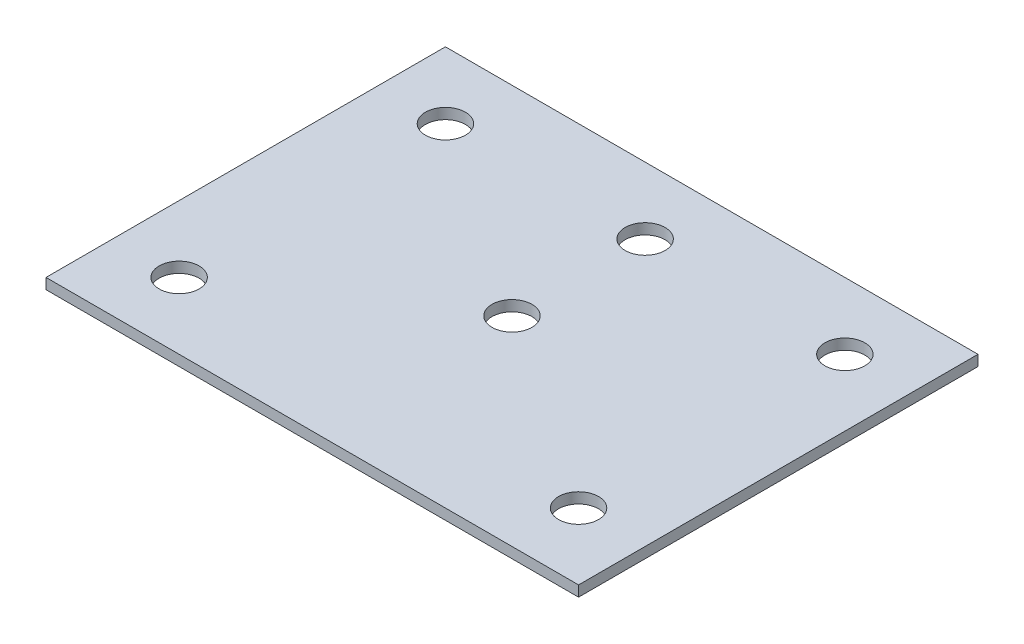
ISO-10303-21;
HEADER;
FILE_DESCRIPTION(('STEP AP214'),'2;1');
FILE_NAME('part.step','',(''),(''),'','','');
FILE_SCHEMA(('AUTOMOTIVE_DESIGN { 1 0 10303 214 1 1 1 1 }'));
ENDSEC;
DATA;
#1=APPLICATION_CONTEXT('core data for automotive mechanical design processes');
#2=APPLICATION_PROTOCOL_DEFINITION('international standard','automotive_design',2000,#1);
#3=PRODUCT_CONTEXT('',#1,'mechanical');
#4=PRODUCT('Part','Part','',(#3));
#5=PRODUCT_RELATED_PRODUCT_CATEGORY('part','',(#4));
#6=PRODUCT_DEFINITION_FORMATION('','',#4);
#7=PRODUCT_DEFINITION_CONTEXT('part definition',#1,'design');
#8=PRODUCT_DEFINITION('design','',#6,#7);
#9=PRODUCT_DEFINITION_SHAPE('','',#8);
#10=(LENGTH_UNIT() NAMED_UNIT(*) SI_UNIT(.MILLI.,.METRE.));
#11=(NAMED_UNIT(*) PLANE_ANGLE_UNIT() SI_UNIT($,.RADIAN.));
#12=(NAMED_UNIT(*) SI_UNIT($,.STERADIAN.) SOLID_ANGLE_UNIT());
#13=UNCERTAINTY_MEASURE_WITH_UNIT(LENGTH_MEASURE(1.E-05),#10,'distance_accuracy_value','');
#14=(GEOMETRIC_REPRESENTATION_CONTEXT(3) GLOBAL_UNCERTAINTY_ASSIGNED_CONTEXT((#13)) GLOBAL_UNIT_ASSIGNED_CONTEXT((#10,
#11,#12)) REPRESENTATION_CONTEXT('',''));
#15=CARTESIAN_POINT('',(0.,0.,0.));
#16=DIRECTION('',(0.,0.,1.));
#17=DIRECTION('',(1.,0.,0.));
#18=AXIS2_PLACEMENT_3D('',#15,#16,#17);
#19=CARTESIAN_POINT('',(0.,1.6,0.));
#20=DIRECTION('',(0.,1.,0.));
#21=DIRECTION('',(0.,0.,1.));
#22=AXIS2_PLACEMENT_3D('',#19,#20,#21);
#23=PLANE('',#22);
#24=CARTESIAN_POINT('',(0.,1.6,-20.0000000000051));
#25=DIRECTION('',(0.,1.,0.));
#26=DIRECTION('',(0.,0.,1.));
#27=AXIS2_PLACEMENT_3D('',#24,#25,#26);
#28=CIRCLE('',#27,3.);
#29=CARTESIAN_POINT('',(0.,1.6,-17.0000000000051));
#30=VERTEX_POINT('',#29);
#31=EDGE_CURVE('E142',#30,#30,#28,.T.);
#32=ORIENTED_EDGE('',*,*,#31,.F.);
#33=EDGE_LOOP('',(#32));
#34=FACE_BOUND('',#33,.T.);
#35=CARTESIAN_POINT('',(30.,1.6,20.));
#36=DIRECTION('',(0.,1.,0.));
#37=DIRECTION('',(0.,0.,1.));
#38=AXIS2_PLACEMENT_3D('',#35,#36,#37);
#39=CIRCLE('',#38,2.99999999999999);
#40=CARTESIAN_POINT('',(30.,1.6,23.));
#41=VERTEX_POINT('',#40);
#42=EDGE_CURVE('E130',#41,#41,#39,.T.);
#43=ORIENTED_EDGE('',*,*,#42,.F.);
#44=EDGE_LOOP('',(#43));
#45=FACE_BOUND('',#44,.T.);
#46=CARTESIAN_POINT('',(-30.,1.6,-20.));
#47=DIRECTION('',(0.,1.,0.));
#48=DIRECTION('',(0.,0.,1.));
#49=AXIS2_PLACEMENT_3D('',#46,#47,#48);
#50=CIRCLE('',#49,3.);
#51=CARTESIAN_POINT('',(-30.,1.6,-17.));
#52=VERTEX_POINT('',#51);
#53=EDGE_CURVE('E109',#52,#52,#50,.T.);
#54=ORIENTED_EDGE('',*,*,#53,.F.);
#55=EDGE_LOOP('',(#54));
#56=FACE_BOUND('',#55,.T.);
#57=DIRECTION('',(0.,0.,-1.));
#58=VECTOR('',#57,1.);
#59=CARTESIAN_POINT('',(40.,1.6,-30.));
#60=LINE('',#59,#58);
#61=CARTESIAN_POINT('',(40.,1.6,30.));
#62=VERTEX_POINT('',#61);
#63=CARTESIAN_POINT('',(40.,1.6,-30.));
#64=VERTEX_POINT('',#63);
#65=EDGE_CURVE('E94',#62,#64,#60,.T.);
#66=ORIENTED_EDGE('',*,*,#65,.T.);
#67=DIRECTION('',(-1.,0.,0.));
#68=VECTOR('',#67,1.);
#69=CARTESIAN_POINT('',(-40.,1.6,-30.));
#70=LINE('',#69,#68);
#71=CARTESIAN_POINT('',(-40.,1.6,-30.));
#72=VERTEX_POINT('',#71);
#73=EDGE_CURVE('E89',#64,#72,#70,.T.);
#74=ORIENTED_EDGE('',*,*,#73,.T.);
#75=DIRECTION('',(0.,0.,1.));
#76=VECTOR('',#75,1.);
#77=CARTESIAN_POINT('',(-40.,1.6,-30.));
#78=LINE('',#77,#76);
#79=CARTESIAN_POINT('',(-40.,1.6,30.));
#80=VERTEX_POINT('',#79);
#81=EDGE_CURVE('E92',#72,#80,#78,.T.);
#82=ORIENTED_EDGE('',*,*,#81,.T.);
#83=DIRECTION('',(1.,0.,0.));
#84=VECTOR('',#83,1.);
#85=CARTESIAN_POINT('',(-40.,1.6,30.));
#86=LINE('',#85,#84);
#87=EDGE_CURVE('E59',#80,#62,#86,.T.);
#88=ORIENTED_EDGE('',*,*,#87,.T.);
#89=EDGE_LOOP('',(#66,#74,#82,#88));
#90=FACE_BOUND('',#89,.T.);
#91=CARTESIAN_POINT('',(-30.,1.6,20.));
#92=DIRECTION('',(0.,1.,0.));
#93=DIRECTION('',(0.,0.,1.));
#94=AXIS2_PLACEMENT_3D('',#91,#92,#93);
#95=CIRCLE('',#94,3.);
#96=CARTESIAN_POINT('',(-30.,1.6,23.));
#97=VERTEX_POINT('',#96);
#98=EDGE_CURVE('E124',#97,#97,#95,.T.);
#99=ORIENTED_EDGE('',*,*,#98,.F.);
#100=EDGE_LOOP('',(#99));
#101=FACE_BOUND('',#100,.T.);
#102=CARTESIAN_POINT('',(30.,1.6,-20.));
#103=DIRECTION('',(0.,1.,0.));
#104=DIRECTION('',(0.,0.,1.));
#105=AXIS2_PLACEMENT_3D('',#102,#103,#104);
#106=CIRCLE('',#105,2.99999999999999);
#107=CARTESIAN_POINT('',(30.,1.6,-17.));
#108=VERTEX_POINT('',#107);
#109=EDGE_CURVE('E136',#108,#108,#106,.T.);
#110=ORIENTED_EDGE('',*,*,#109,.F.);
#111=EDGE_LOOP('',(#110));
#112=FACE_BOUND('',#111,.T.);
#113=CARTESIAN_POINT('',(0.,1.6,0.));
#114=DIRECTION('',(0.,1.,0.));
#115=DIRECTION('',(0.,0.,1.));
#116=AXIS2_PLACEMENT_3D('',#113,#114,#115);
#117=CIRCLE('',#116,3.);
#118=CARTESIAN_POINT('',(0.,1.6,2.99999999999999));
#119=VERTEX_POINT('',#118);
#120=EDGE_CURVE('E148',#119,#119,#117,.T.);
#121=ORIENTED_EDGE('',*,*,#120,.F.);
#122=EDGE_LOOP('',(#121));
#123=FACE_BOUND('',#122,.T.);
#124=ADVANCED_FACE('F42',(#34,#45,#56,#90,#101,#112,#123),#23,.T.);
#125=CARTESIAN_POINT('',(0.,0.,0.));
#126=DIRECTION('',(0.,1.,0.));
#127=DIRECTION('',(0.,0.,1.));
#128=AXIS2_PLACEMENT_3D('',#125,#126,#127);
#129=PLANE('',#128);
#130=DIRECTION('',(0.,0.,-1.));
#131=VECTOR('',#130,1.);
#132=CARTESIAN_POINT('',(40.,0.,-30.));
#133=LINE('',#132,#131);
#134=CARTESIAN_POINT('',(40.,0.,30.));
#135=VERTEX_POINT('',#134);
#136=CARTESIAN_POINT('',(40.,0.,-30.));
#137=VERTEX_POINT('',#136);
#138=EDGE_CURVE('E106',#135,#137,#133,.T.);
#139=ORIENTED_EDGE('',*,*,#138,.F.);
#140=DIRECTION('',(1.,0.,0.));
#141=VECTOR('',#140,1.);
#142=CARTESIAN_POINT('',(-40.,0.,30.));
#143=LINE('',#142,#141);
#144=CARTESIAN_POINT('',(-40.,0.,30.));
#145=VERTEX_POINT('',#144);
#146=EDGE_CURVE('E82',#145,#135,#143,.T.);
#147=ORIENTED_EDGE('',*,*,#146,.F.);
#148=DIRECTION('',(0.,0.,1.));
#149=VECTOR('',#148,1.);
#150=CARTESIAN_POINT('',(-40.,0.,-30.));
#151=LINE('',#150,#149);
#152=CARTESIAN_POINT('',(-40.,0.,-30.));
#153=VERTEX_POINT('',#152);
#154=EDGE_CURVE('E76',#153,#145,#151,.T.);
#155=ORIENTED_EDGE('',*,*,#154,.F.);
#156=DIRECTION('',(-1.,0.,0.));
#157=VECTOR('',#156,1.);
#158=CARTESIAN_POINT('',(-40.,0.,-30.));
#159=LINE('',#158,#157);
#160=EDGE_CURVE('E98',#137,#153,#159,.T.);
#161=ORIENTED_EDGE('',*,*,#160,.F.);
#162=EDGE_LOOP('',(#139,#147,#155,#161));
#163=FACE_BOUND('',#162,.T.);
#164=CARTESIAN_POINT('',(-30.,0.,-20.));
#165=DIRECTION('',(0.,1.,0.));
#166=DIRECTION('',(0.,0.,1.));
#167=AXIS2_PLACEMENT_3D('',#164,#165,#166);
#168=CIRCLE('',#167,3.);
#169=CARTESIAN_POINT('',(-30.,0.,-17.));
#170=VERTEX_POINT('',#169);
#171=EDGE_CURVE('E121',#170,#170,#168,.T.);
#172=ORIENTED_EDGE('',*,*,#171,.T.);
#173=EDGE_LOOP('',(#172));
#174=FACE_BOUND('',#173,.T.);
#175=CARTESIAN_POINT('',(-30.,0.,20.));
#176=DIRECTION('',(0.,1.,0.));
#177=DIRECTION('',(0.,0.,1.));
#178=AXIS2_PLACEMENT_3D('',#175,#176,#177);
#179=CIRCLE('',#178,3.);
#180=CARTESIAN_POINT('',(-30.,0.,23.));
#181=VERTEX_POINT('',#180);
#182=EDGE_CURVE('E127',#181,#181,#179,.T.);
#183=ORIENTED_EDGE('',*,*,#182,.T.);
#184=EDGE_LOOP('',(#183));
#185=FACE_BOUND('',#184,.T.);
#186=CARTESIAN_POINT('',(30.,0.,20.));
#187=DIRECTION('',(0.,1.,0.));
#188=DIRECTION('',(0.,0.,1.));
#189=AXIS2_PLACEMENT_3D('',#186,#187,#188);
#190=CIRCLE('',#189,2.99999999999999);
#191=CARTESIAN_POINT('',(30.,0.,23.));
#192=VERTEX_POINT('',#191);
#193=EDGE_CURVE('E133',#192,#192,#190,.T.);
#194=ORIENTED_EDGE('',*,*,#193,.T.);
#195=EDGE_LOOP('',(#194));
#196=FACE_BOUND('',#195,.T.);
#197=CARTESIAN_POINT('',(30.,0.,-20.));
#198=DIRECTION('',(0.,1.,0.));
#199=DIRECTION('',(0.,0.,1.));
#200=AXIS2_PLACEMENT_3D('',#197,#198,#199);
#201=CIRCLE('',#200,2.99999999999999);
#202=CARTESIAN_POINT('',(30.,0.,-17.));
#203=VERTEX_POINT('',#202);
#204=EDGE_CURVE('E139',#203,#203,#201,.T.);
#205=ORIENTED_EDGE('',*,*,#204,.T.);
#206=EDGE_LOOP('',(#205));
#207=FACE_BOUND('',#206,.T.);
#208=CARTESIAN_POINT('',(0.,0.,-20.0000000000051));
#209=DIRECTION('',(0.,1.,0.));
#210=DIRECTION('',(0.,0.,1.));
#211=AXIS2_PLACEMENT_3D('',#208,#209,#210);
#212=CIRCLE('',#211,3.);
#213=CARTESIAN_POINT('',(0.,0.,-17.0000000000051));
#214=VERTEX_POINT('',#213);
#215=EDGE_CURVE('E145',#214,#214,#212,.T.);
#216=ORIENTED_EDGE('',*,*,#215,.T.);
#217=EDGE_LOOP('',(#216));
#218=FACE_BOUND('',#217,.T.);
#219=CARTESIAN_POINT('',(0.,0.,0.));
#220=DIRECTION('',(0.,1.,0.));
#221=DIRECTION('',(0.,0.,1.));
#222=AXIS2_PLACEMENT_3D('',#219,#220,#221);
#223=CIRCLE('',#222,3.);
#224=CARTESIAN_POINT('',(0.,0.,2.99999999999999));
#225=VERTEX_POINT('',#224);
#226=EDGE_CURVE('E151',#225,#225,#223,.T.);
#227=ORIENTED_EDGE('',*,*,#226,.T.);
#228=EDGE_LOOP('',(#227));
#229=FACE_BOUND('',#228,.T.);
#230=ADVANCED_FACE('F117',(#163,#174,#185,#196,#207,#218,#229),#129,.F.);
#231=CARTESIAN_POINT('',(40.,1.6,-30.));
#232=DIRECTION('',(-1.,0.,0.));
#233=DIRECTION('',(0.,0.,1.));
#234=AXIS2_PLACEMENT_3D('',#231,#232,#233);
#235=PLANE('',#234);
#236=ORIENTED_EDGE('',*,*,#138,.T.);
#237=DIRECTION('',(0.,-1.,0.));
#238=VECTOR('',#237,1.);
#239=CARTESIAN_POINT('',(40.,1.6,-30.));
#240=LINE('',#239,#238);
#241=EDGE_CURVE('E11',#64,#137,#240,.T.);
#242=ORIENTED_EDGE('',*,*,#241,.F.);
#243=ORIENTED_EDGE('',*,*,#65,.F.);
#244=DIRECTION('',(0.,-1.,0.));
#245=VECTOR('',#244,1.);
#246=CARTESIAN_POINT('',(40.,1.6,30.));
#247=LINE('',#246,#245);
#248=EDGE_CURVE('E102',#62,#135,#247,.T.);
#249=ORIENTED_EDGE('',*,*,#248,.T.);
#250=EDGE_LOOP('',(#236,#242,#243,#249));
#251=FACE_BOUND('',#250,.T.);
#252=ADVANCED_FACE('F44',(#251),#235,.F.);
#253=CARTESIAN_POINT('',(-40.,1.6,-30.));
#254=DIRECTION('',(0.,0.,1.));
#255=DIRECTION('',(1.,0.,0.));
#256=AXIS2_PLACEMENT_3D('',#253,#254,#255);
#257=PLANE('',#256);
#258=ORIENTED_EDGE('',*,*,#160,.T.);
#259=DIRECTION('',(0.,-1.,0.));
#260=VECTOR('',#259,1.);
#261=CARTESIAN_POINT('',(-40.,1.6,-30.));
#262=LINE('',#261,#260);
#263=EDGE_CURVE('E51',#72,#153,#262,.T.);
#264=ORIENTED_EDGE('',*,*,#263,.F.);
#265=ORIENTED_EDGE('',*,*,#73,.F.);
#266=ORIENTED_EDGE('',*,*,#241,.T.);
#267=EDGE_LOOP('',(#258,#264,#265,#266));
#268=FACE_BOUND('',#267,.T.);
#269=ADVANCED_FACE('F97',(#268),#257,.F.);
#270=CARTESIAN_POINT('',(-40.,1.6,-30.));
#271=DIRECTION('',(1.,0.,0.));
#272=DIRECTION('',(0.,0.,-1.));
#273=AXIS2_PLACEMENT_3D('',#270,#271,#272);
#274=PLANE('',#273);
#275=ORIENTED_EDGE('',*,*,#154,.T.);
#276=DIRECTION('',(0.,-1.,0.));
#277=VECTOR('',#276,1.);
#278=CARTESIAN_POINT('',(-40.,1.6,30.));
#279=LINE('',#278,#277);
#280=EDGE_CURVE('E99',#80,#145,#279,.T.);
#281=ORIENTED_EDGE('',*,*,#280,.F.);
#282=ORIENTED_EDGE('',*,*,#81,.F.);
#283=ORIENTED_EDGE('',*,*,#263,.T.);
#284=EDGE_LOOP('',(#275,#281,#282,#283));
#285=FACE_BOUND('',#284,.T.);
#286=ADVANCED_FACE('F100',(#285),#274,.F.);
#287=CARTESIAN_POINT('',(-40.,1.6,30.));
#288=DIRECTION('',(0.,0.,-1.));
#289=DIRECTION('',(-1.,0.,0.));
#290=AXIS2_PLACEMENT_3D('',#287,#288,#289);
#291=PLANE('',#290);
#292=ORIENTED_EDGE('',*,*,#146,.T.);
#293=ORIENTED_EDGE('',*,*,#248,.F.);
#294=ORIENTED_EDGE('',*,*,#87,.F.);
#295=ORIENTED_EDGE('',*,*,#280,.T.);
#296=EDGE_LOOP('',(#292,#293,#294,#295));
#297=FACE_BOUND('',#296,.T.);
#298=ADVANCED_FACE('F114',(#297),#291,.F.);
#299=CARTESIAN_POINT('',(-30.,1.6,-20.));
#300=DIRECTION('',(0.,-1.,0.));
#301=DIRECTION('',(0.,0.,-1.));
#302=AXIS2_PLACEMENT_3D('',#299,#300,#301);
#303=CYLINDRICAL_SURFACE('',#302,3.);
#304=ORIENTED_EDGE('',*,*,#53,.T.);
#305=EDGE_LOOP('',(#304));
#306=FACE_BOUND('',#305,.T.);
#307=ORIENTED_EDGE('',*,*,#171,.F.);
#308=EDGE_LOOP('',(#307));
#309=FACE_BOUND('',#308,.T.);
#310=ADVANCED_FACE('F170',(#306,#309),#303,.F.);
#311=CARTESIAN_POINT('',(-30.,1.6,20.));
#312=DIRECTION('',(0.,-1.,0.));
#313=DIRECTION('',(0.,0.,-1.));
#314=AXIS2_PLACEMENT_3D('',#311,#312,#313);
#315=CYLINDRICAL_SURFACE('',#314,3.);
#316=ORIENTED_EDGE('',*,*,#98,.T.);
#317=EDGE_LOOP('',(#316));
#318=FACE_BOUND('',#317,.T.);
#319=ORIENTED_EDGE('',*,*,#182,.F.);
#320=EDGE_LOOP('',(#319));
#321=FACE_BOUND('',#320,.T.);
#322=ADVANCED_FACE('F238',(#318,#321),#315,.F.);
#323=CARTESIAN_POINT('',(30.,1.6,20.));
#324=DIRECTION('',(0.,-1.,0.));
#325=DIRECTION('',(0.,0.,-1.));
#326=AXIS2_PLACEMENT_3D('',#323,#324,#325);
#327=CYLINDRICAL_SURFACE('',#326,2.99999999999999);
#328=ORIENTED_EDGE('',*,*,#42,.T.);
#329=EDGE_LOOP('',(#328));
#330=FACE_BOUND('',#329,.T.);
#331=ORIENTED_EDGE('',*,*,#193,.F.);
#332=EDGE_LOOP('',(#331));
#333=FACE_BOUND('',#332,.T.);
#334=ADVANCED_FACE('F249',(#330,#333),#327,.F.);
#335=CARTESIAN_POINT('',(30.,1.6,-20.));
#336=DIRECTION('',(0.,-1.,0.));
#337=DIRECTION('',(0.,0.,-1.));
#338=AXIS2_PLACEMENT_3D('',#335,#336,#337);
#339=CYLINDRICAL_SURFACE('',#338,2.99999999999999);
#340=ORIENTED_EDGE('',*,*,#109,.T.);
#341=EDGE_LOOP('',(#340));
#342=FACE_BOUND('',#341,.T.);
#343=ORIENTED_EDGE('',*,*,#204,.F.);
#344=EDGE_LOOP('',(#343));
#345=FACE_BOUND('',#344,.T.);
#346=ADVANCED_FACE('F260',(#342,#345),#339,.F.);
#347=CARTESIAN_POINT('',(0.,1.6,-20.0000000000051));
#348=DIRECTION('',(0.,-1.,0.));
#349=DIRECTION('',(0.,0.,-1.));
#350=AXIS2_PLACEMENT_3D('',#347,#348,#349);
#351=CYLINDRICAL_SURFACE('',#350,3.);
#352=ORIENTED_EDGE('',*,*,#31,.T.);
#353=EDGE_LOOP('',(#352));
#354=FACE_BOUND('',#353,.T.);
#355=ORIENTED_EDGE('',*,*,#215,.F.);
#356=EDGE_LOOP('',(#355));
#357=FACE_BOUND('',#356,.T.);
#358=ADVANCED_FACE('F272',(#354,#357),#351,.F.);
#359=CARTESIAN_POINT('',(0.,1.6,0.));
#360=DIRECTION('',(0.,-1.,0.));
#361=DIRECTION('',(0.,0.,-1.));
#362=AXIS2_PLACEMENT_3D('',#359,#360,#361);
#363=CYLINDRICAL_SURFACE('',#362,3.);
#364=ORIENTED_EDGE('',*,*,#120,.T.);
#365=EDGE_LOOP('',(#364));
#366=FACE_BOUND('',#365,.T.);
#367=ORIENTED_EDGE('',*,*,#226,.F.);
#368=EDGE_LOOP('',(#367));
#369=FACE_BOUND('',#368,.T.);
#370=ADVANCED_FACE('F157',(#366,#369),#363,.F.);
#371=CLOSED_SHELL('',(#124,#230,#252,#269,#286,#298,#310,#322,#334,#346,#358,#370));
#372=MANIFOLD_SOLID_BREP('B2',#371);
#373=ADVANCED_BREP_SHAPE_REPRESENTATION('',(#18,#372),#14);
#374=SHAPE_DEFINITION_REPRESENTATION(#9,#373);
ENDSEC;
END-ISO-10303-21;
